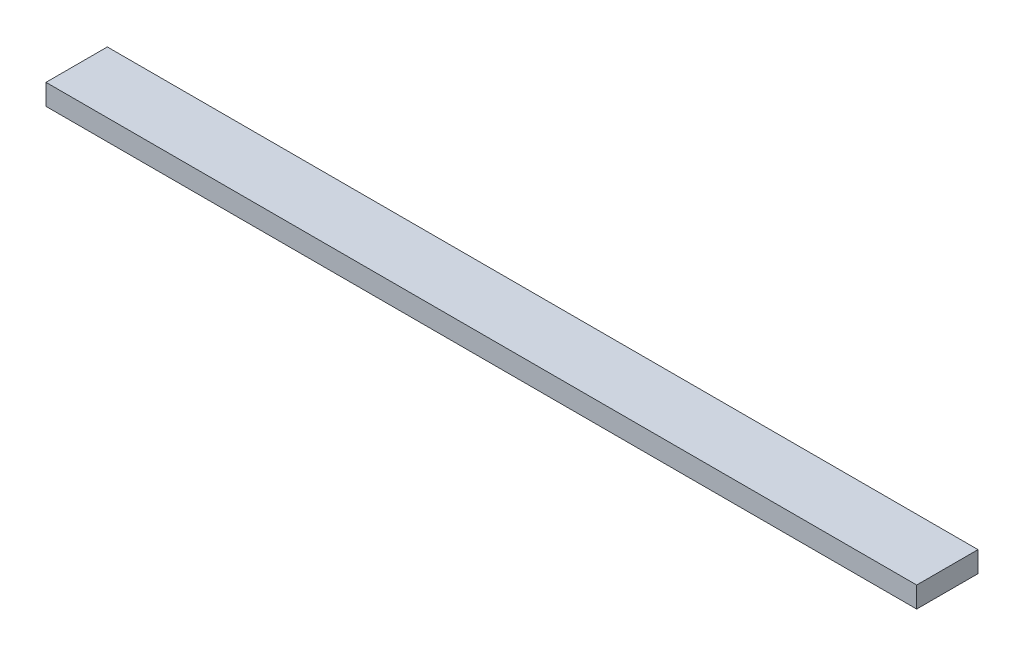
ISO-10303-21;
HEADER;
FILE_DESCRIPTION(('STEP AP214'),'2;1');
FILE_NAME('part.step','',(''),(''),'','','');
FILE_SCHEMA(('AUTOMOTIVE_DESIGN { 1 0 10303 214 1 1 1 1 }'));
ENDSEC;
DATA;
#1=APPLICATION_CONTEXT('core data for automotive mechanical design processes');
#2=APPLICATION_PROTOCOL_DEFINITION('international standard','automotive_design',2000,#1);
#3=PRODUCT_CONTEXT('',#1,'mechanical');
#4=PRODUCT('Part','Part','',(#3));
#5=PRODUCT_RELATED_PRODUCT_CATEGORY('part','',(#4));
#6=PRODUCT_DEFINITION_FORMATION('','',#4);
#7=PRODUCT_DEFINITION_CONTEXT('part definition',#1,'design');
#8=PRODUCT_DEFINITION('design','',#6,#7);
#9=PRODUCT_DEFINITION_SHAPE('','',#8);
#10=(LENGTH_UNIT() NAMED_UNIT(*) SI_UNIT(.MILLI.,.METRE.));
#11=(NAMED_UNIT(*) PLANE_ANGLE_UNIT() SI_UNIT($,.RADIAN.));
#12=(NAMED_UNIT(*) SI_UNIT($,.STERADIAN.) SOLID_ANGLE_UNIT());
#13=UNCERTAINTY_MEASURE_WITH_UNIT(LENGTH_MEASURE(1.E-05),#10,'distance_accuracy_value','');
#14=(GEOMETRIC_REPRESENTATION_CONTEXT(3) GLOBAL_UNCERTAINTY_ASSIGNED_CONTEXT((#13)) GLOBAL_UNIT_ASSIGNED_CONTEXT((#10,
#11,#12)) REPRESENTATION_CONTEXT('',''));
#15=CARTESIAN_POINT('',(0.,0.,0.));
#16=DIRECTION('',(0.,0.,1.));
#17=DIRECTION('',(1.,0.,0.));
#18=AXIS2_PLACEMENT_3D('',#15,#16,#17);
#19=CARTESIAN_POINT('',(35.5,0.85,5.));
#20=DIRECTION('',(-1.,0.,0.));
#21=DIRECTION('',(0.,0.,1.));
#22=AXIS2_PLACEMENT_3D('',#19,#20,#21);
#23=PLANE('',#22);
#24=DIRECTION('',(0.,1.,0.));
#25=VECTOR('',#24,1.);
#26=CARTESIAN_POINT('',(35.5,0.85,0.));
#27=LINE('',#26,#25);
#28=CARTESIAN_POINT('',(35.5,-0.85,0.));
#29=VERTEX_POINT('',#28);
#30=CARTESIAN_POINT('',(35.5,0.85,0.));
#31=VERTEX_POINT('',#30);
#32=EDGE_CURVE('E102',#29,#31,#27,.T.);
#33=ORIENTED_EDGE('',*,*,#32,.T.);
#34=DIRECTION('',(0.,0.,-1.));
#35=VECTOR('',#34,1.);
#36=CARTESIAN_POINT('',(35.5,0.85,5.));
#37=LINE('',#36,#35);
#38=CARTESIAN_POINT('',(35.5,0.85,5.));
#39=VERTEX_POINT('',#38);
#40=EDGE_CURVE('E11',#39,#31,#37,.T.);
#41=ORIENTED_EDGE('',*,*,#40,.F.);
#42=DIRECTION('',(0.,1.,0.));
#43=VECTOR('',#42,1.);
#44=CARTESIAN_POINT('',(35.5,0.85,5.));
#45=LINE('',#44,#43);
#46=CARTESIAN_POINT('',(35.5,-0.85,5.));
#47=VERTEX_POINT('',#46);
#48=EDGE_CURVE('E90',#47,#39,#45,.T.);
#49=ORIENTED_EDGE('',*,*,#48,.F.);
#50=DIRECTION('',(0.,0.,-1.));
#51=VECTOR('',#50,1.);
#52=CARTESIAN_POINT('',(35.5,-0.85,5.));
#53=LINE('',#52,#51);
#54=EDGE_CURVE('E98',#47,#29,#53,.T.);
#55=ORIENTED_EDGE('',*,*,#54,.T.);
#56=EDGE_LOOP('',(#33,#41,#49,#55));
#57=FACE_BOUND('',#56,.T.);
#58=ADVANCED_FACE('F39',(#57),#23,.F.);
#59=CARTESIAN_POINT('',(-35.5,0.85,5.));
#60=DIRECTION('',(0.,-1.,0.));
#61=DIRECTION('',(0.,0.,-1.));
#62=AXIS2_PLACEMENT_3D('',#59,#60,#61);
#63=PLANE('',#62);
#64=DIRECTION('',(-1.,0.,0.));
#65=VECTOR('',#64,1.);
#66=CARTESIAN_POINT('',(-35.5,0.85,0.));
#67=LINE('',#66,#65);
#68=CARTESIAN_POINT('',(-35.5,0.85,0.));
#69=VERTEX_POINT('',#68);
#70=EDGE_CURVE('E94',#31,#69,#67,.T.);
#71=ORIENTED_EDGE('',*,*,#70,.T.);
#72=DIRECTION('',(0.,0.,-1.));
#73=VECTOR('',#72,1.);
#74=CARTESIAN_POINT('',(-35.5,0.85,5.));
#75=LINE('',#74,#73);
#76=CARTESIAN_POINT('',(-35.5,0.85,5.));
#77=VERTEX_POINT('',#76);
#78=EDGE_CURVE('E47',#77,#69,#75,.T.);
#79=ORIENTED_EDGE('',*,*,#78,.F.);
#80=DIRECTION('',(-1.,0.,0.));
#81=VECTOR('',#80,1.);
#82=CARTESIAN_POINT('',(-35.5,0.85,5.));
#83=LINE('',#82,#81);
#84=EDGE_CURVE('E85',#39,#77,#83,.T.);
#85=ORIENTED_EDGE('',*,*,#84,.F.);
#86=ORIENTED_EDGE('',*,*,#40,.T.);
#87=EDGE_LOOP('',(#71,#79,#85,#86));
#88=FACE_BOUND('',#87,.T.);
#89=ADVANCED_FACE('F93',(#88),#63,.F.);
#90=CARTESIAN_POINT('',(-35.5,0.85,5.));
#91=DIRECTION('',(1.,0.,0.));
#92=DIRECTION('',(0.,0.,-1.));
#93=AXIS2_PLACEMENT_3D('',#90,#91,#92);
#94=PLANE('',#93);
#95=DIRECTION('',(0.,-1.,0.));
#96=VECTOR('',#95,1.);
#97=CARTESIAN_POINT('',(-35.5,0.85,0.));
#98=LINE('',#97,#96);
#99=CARTESIAN_POINT('',(-35.5,-0.85,0.));
#100=VERTEX_POINT('',#99);
#101=EDGE_CURVE('E72',#69,#100,#98,.T.);
#102=ORIENTED_EDGE('',*,*,#101,.T.);
#103=DIRECTION('',(0.,0.,-1.));
#104=VECTOR('',#103,1.);
#105=CARTESIAN_POINT('',(-35.5,-0.85,5.));
#106=LINE('',#105,#104);
#107=CARTESIAN_POINT('',(-35.5,-0.85,5.));
#108=VERTEX_POINT('',#107);
#109=EDGE_CURVE('E95',#108,#100,#106,.T.);
#110=ORIENTED_EDGE('',*,*,#109,.F.);
#111=DIRECTION('',(0.,-1.,0.));
#112=VECTOR('',#111,1.);
#113=CARTESIAN_POINT('',(-35.5,0.85,5.));
#114=LINE('',#113,#112);
#115=EDGE_CURVE('E88',#77,#108,#114,.T.);
#116=ORIENTED_EDGE('',*,*,#115,.F.);
#117=ORIENTED_EDGE('',*,*,#78,.T.);
#118=EDGE_LOOP('',(#102,#110,#116,#117));
#119=FACE_BOUND('',#118,.T.);
#120=ADVANCED_FACE('F96',(#119),#94,.F.);
#121=CARTESIAN_POINT('',(-35.5,-0.85,5.));
#122=DIRECTION('',(0.,1.,0.));
#123=DIRECTION('',(0.,0.,1.));
#124=AXIS2_PLACEMENT_3D('',#121,#122,#123);
#125=PLANE('',#124);
#126=DIRECTION('',(1.,0.,0.));
#127=VECTOR('',#126,1.);
#128=CARTESIAN_POINT('',(-35.5,-0.85,0.));
#129=LINE('',#128,#127);
#130=EDGE_CURVE('E78',#100,#29,#129,.T.);
#131=ORIENTED_EDGE('',*,*,#130,.T.);
#132=ORIENTED_EDGE('',*,*,#54,.F.);
#133=DIRECTION('',(1.,0.,0.));
#134=VECTOR('',#133,1.);
#135=CARTESIAN_POINT('',(-35.5,-0.85,5.));
#136=LINE('',#135,#134);
#137=EDGE_CURVE('E55',#108,#47,#136,.T.);
#138=ORIENTED_EDGE('',*,*,#137,.F.);
#139=ORIENTED_EDGE('',*,*,#109,.T.);
#140=EDGE_LOOP('',(#131,#132,#138,#139));
#141=FACE_BOUND('',#140,.T.);
#142=ADVANCED_FACE('F109',(#141),#125,.F.);
#143=CARTESIAN_POINT('',(0.,0.,5.));
#144=DIRECTION('',(0.,0.,1.));
#145=DIRECTION('',(1.,0.,0.));
#146=AXIS2_PLACEMENT_3D('',#143,#144,#145);
#147=PLANE('',#146);
#148=ORIENTED_EDGE('',*,*,#48,.T.);
#149=ORIENTED_EDGE('',*,*,#84,.T.);
#150=ORIENTED_EDGE('',*,*,#115,.T.);
#151=ORIENTED_EDGE('',*,*,#137,.T.);
#152=EDGE_LOOP('',(#148,#149,#150,#151));
#153=FACE_BOUND('',#152,.T.);
#154=ADVANCED_FACE('F86',(#153),#147,.T.);
#155=CARTESIAN_POINT('',(0.,0.,0.));
#156=DIRECTION('',(0.,0.,1.));
#157=DIRECTION('',(1.,0.,0.));
#158=AXIS2_PLACEMENT_3D('',#155,#156,#157);
#159=PLANE('',#158);
#160=ORIENTED_EDGE('',*,*,#32,.F.);
#161=ORIENTED_EDGE('',*,*,#130,.F.);
#162=ORIENTED_EDGE('',*,*,#101,.F.);
#163=ORIENTED_EDGE('',*,*,#70,.F.);
#164=EDGE_LOOP('',(#160,#161,#162,#163));
#165=FACE_BOUND('',#164,.T.);
#166=ADVANCED_FACE('F112',(#165),#159,.F.);
#167=CLOSED_SHELL('',(#58,#89,#120,#142,#154,#166));
#168=MANIFOLD_SOLID_BREP('B2',#167);
#169=ADVANCED_BREP_SHAPE_REPRESENTATION('',(#18,#168),#14);
#170=SHAPE_DEFINITION_REPRESENTATION(#9,#169);
ENDSEC;
END-ISO-10303-21;
